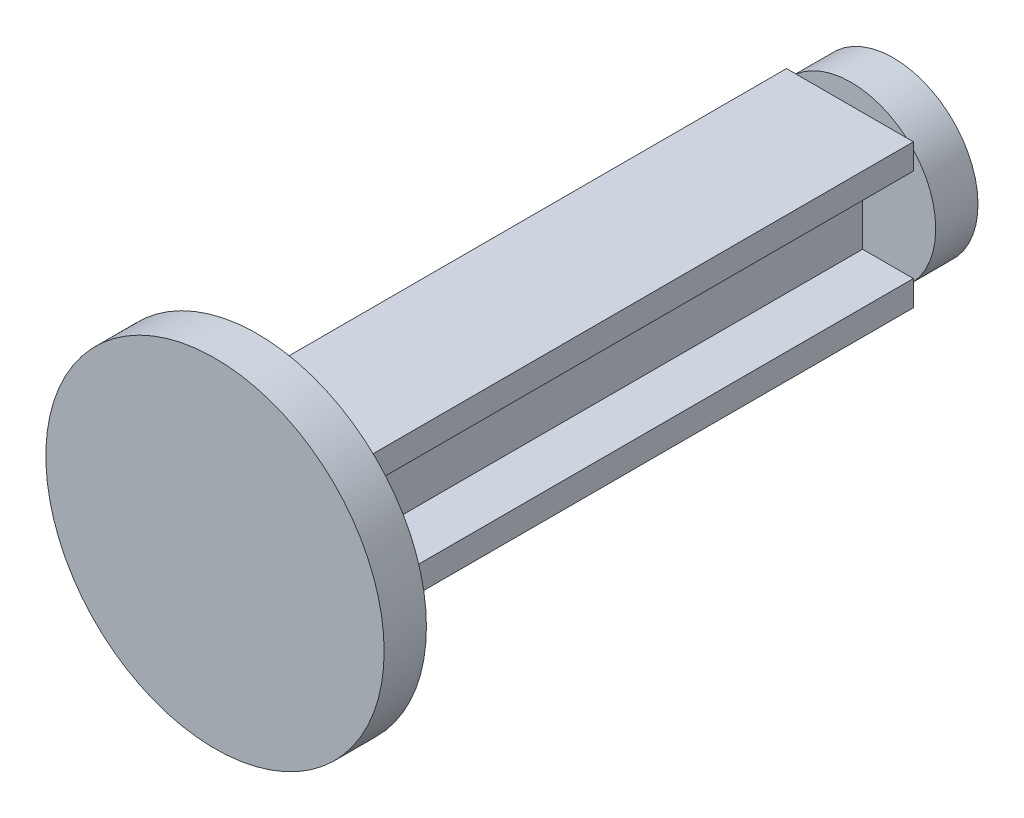
ISO-10303-21;
HEADER;
FILE_DESCRIPTION(('STEP AP214'),'2;1');
FILE_NAME('part.step','',(''),(''),'','','');
FILE_SCHEMA(('AUTOMOTIVE_DESIGN { 1 0 10303 214 1 1 1 1 }'));
ENDSEC;
DATA;
#1=APPLICATION_CONTEXT('core data for automotive mechanical design processes');
#2=APPLICATION_PROTOCOL_DEFINITION('international standard','automotive_design',2000,#1);
#3=PRODUCT_CONTEXT('',#1,'mechanical');
#4=PRODUCT('Part','Part','',(#3));
#5=PRODUCT_RELATED_PRODUCT_CATEGORY('part','',(#4));
#6=PRODUCT_DEFINITION_FORMATION('','',#4);
#7=PRODUCT_DEFINITION_CONTEXT('part definition',#1,'design');
#8=PRODUCT_DEFINITION('design','',#6,#7);
#9=PRODUCT_DEFINITION_SHAPE('','',#8);
#10=(LENGTH_UNIT() NAMED_UNIT(*) SI_UNIT(.MILLI.,.METRE.));
#11=(NAMED_UNIT(*) PLANE_ANGLE_UNIT() SI_UNIT($,.RADIAN.));
#12=(NAMED_UNIT(*) SI_UNIT($,.STERADIAN.) SOLID_ANGLE_UNIT());
#13=UNCERTAINTY_MEASURE_WITH_UNIT(LENGTH_MEASURE(1.E-05),#10,'distance_accuracy_value','');
#14=(GEOMETRIC_REPRESENTATION_CONTEXT(3) GLOBAL_UNCERTAINTY_ASSIGNED_CONTEXT((#13)) GLOBAL_UNIT_ASSIGNED_CONTEXT((#10,
#11,#12)) REPRESENTATION_CONTEXT('',''));
#15=CARTESIAN_POINT('',(0.,0.,0.));
#16=DIRECTION('',(0.,0.,1.));
#17=DIRECTION('',(1.,0.,0.));
#18=AXIS2_PLACEMENT_3D('',#15,#16,#17);
#19=CARTESIAN_POINT('',(0.,0.,0.));
#20=DIRECTION('',(0.,0.,1.));
#21=DIRECTION('',(1.,0.,0.));
#22=AXIS2_PLACEMENT_3D('',#19,#20,#21);
#23=PLANE('',#22);
#24=CARTESIAN_POINT('',(-8.59379801984639,0.,0.));
#25=DIRECTION('',(0.,0.,-1.));
#26=DIRECTION('',(-1.,0.,0.));
#27=AXIS2_PLACEMENT_3D('',#24,#25,#26);
#28=CIRCLE('',#27,20.);
#29=CARTESIAN_POINT('',(-23.8794937504474,12.8975775257018,0.));
#30=VERTEX_POINT('',#29);
#31=CARTESIAN_POINT('',(-21.63355885004,15.1645849759019,0.));
#32=VERTEX_POINT('',#31);
#33=EDGE_CURVE('E212',#30,#32,#28,.T.);
#34=ORIENTED_EDGE('',*,*,#33,.F.);
#35=DIRECTION('',(0.,-1.,0.));
#36=VECTOR('',#35,1.);
#37=CARTESIAN_POINT('',(-23.8794937504474,0.,0.));
#38=LINE('',#37,#36);
#39=CARTESIAN_POINT('',(-23.8794937504474,15.1645849759019,0.));
#40=VERTEX_POINT('',#39);
#41=EDGE_CURVE('E251',#40,#30,#38,.T.);
#42=ORIENTED_EDGE('',*,*,#41,.F.);
#43=DIRECTION('',(1.,0.,0.));
#44=VECTOR('',#43,1.);
#45=CARTESIAN_POINT('',(0.,15.1645849759019,0.));
#46=LINE('',#45,#44);
#47=EDGE_CURVE('E248',#40,#32,#46,.T.);
#48=ORIENTED_EDGE('',*,*,#47,.T.);
#49=EDGE_LOOP('',(#34,#42,#48));
#50=FACE_BOUND('',#49,.T.);
#51=ADVANCED_FACE('F60',(#50),#23,.F.);
#52=CARTESIAN_POINT('',(4.44596281034719,15.1645849759019,0.));
#53=VERTEX_POINT('',#52);
#54=CARTESIAN_POINT('',(6.12050624955264,13.5458203837031,0.));
#55=VERTEX_POINT('',#54);
#56=EDGE_CURVE('E14',#53,#55,#28,.T.);
#57=ORIENTED_EDGE('',*,*,#56,.F.);
#58=CARTESIAN_POINT('',(6.12050624955264,15.1645849759019,0.));
#59=VERTEX_POINT('',#58);
#60=EDGE_CURVE('E250',#53,#59,#46,.T.);
#61=ORIENTED_EDGE('',*,*,#60,.T.);
#62=DIRECTION('',(0.,-1.,0.));
#63=VECTOR('',#62,1.);
#64=CARTESIAN_POINT('',(6.12050624955264,0.,0.));
#65=LINE('',#64,#63);
#66=EDGE_CURVE('E247',#59,#55,#65,.T.);
#67=ORIENTED_EDGE('',*,*,#66,.T.);
#68=EDGE_LOOP('',(#57,#61,#67));
#69=FACE_BOUND('',#68,.T.);
#70=ADVANCED_FACE('F368',(#69),#23,.F.);
#71=CARTESIAN_POINT('',(6.12050624955264,-13.5458203837031,0.));
#72=VERTEX_POINT('',#71);
#73=CARTESIAN_POINT('',(-1.86868531670314,-18.8354150240981,0.));
#74=VERTEX_POINT('',#73);
#75=EDGE_CURVE('E68',#72,#74,#28,.T.);
#76=ORIENTED_EDGE('',*,*,#75,.F.);
#77=DIRECTION('',(0.,-1.,0.));
#78=VECTOR('',#77,1.);
#79=CARTESIAN_POINT('',(6.12050624955264,0.,0.));
#80=LINE('',#79,#78);
#81=CARTESIAN_POINT('',(6.12050624955264,-18.8354150240981,0.));
#82=VERTEX_POINT('',#81);
#83=EDGE_CURVE('E275',#72,#82,#80,.T.);
#84=ORIENTED_EDGE('',*,*,#83,.T.);
#85=DIRECTION('',(1.,0.,0.));
#86=VECTOR('',#85,1.);
#87=CARTESIAN_POINT('',(0.,-18.8354150240981,0.));
#88=LINE('',#87,#86);
#89=EDGE_CURVE('E268',#74,#82,#88,.T.);
#90=ORIENTED_EDGE('',*,*,#89,.F.);
#91=EDGE_LOOP('',(#76,#84,#90));
#92=FACE_BOUND('',#91,.T.);
#93=ADVANCED_FACE('F308',(#92),#23,.F.);
#94=CARTESIAN_POINT('',(6.12050624955264,0.,140.));
#95=DIRECTION('',(1.,0.,0.));
#96=DIRECTION('',(0.,1.,0.));
#97=AXIS2_PLACEMENT_3D('',#94,#95,#96);
#98=PLANE('',#97);
#99=ORIENTED_EDGE('',*,*,#66,.F.);
#100=DIRECTION('',(0.,0.,-1.));
#101=VECTOR('',#100,1.);
#102=CARTESIAN_POINT('',(6.12050624955264,15.1645849759019,140.));
#103=LINE('',#102,#101);
#104=CARTESIAN_POINT('',(6.12050624955264,15.1645849759019,140.));
#105=VERTEX_POINT('',#104);
#106=EDGE_CURVE('E62',#105,#59,#103,.T.);
#107=ORIENTED_EDGE('',*,*,#106,.F.);
#108=DIRECTION('',(0.,-1.,0.));
#109=VECTOR('',#108,1.);
#110=CARTESIAN_POINT('',(6.12050624955264,0.,140.));
#111=LINE('',#110,#109);
#112=CARTESIAN_POINT('',(6.12050624955264,9.16458497590189,140.));
#113=VERTEX_POINT('',#112);
#114=EDGE_CURVE('E175',#105,#113,#111,.T.);
#115=ORIENTED_EDGE('',*,*,#114,.T.);
#116=DIRECTION('',(0.,0.,-1.));
#117=VECTOR('',#116,1.);
#118=CARTESIAN_POINT('',(6.12050624955264,9.16458497590189,140.));
#119=LINE('',#118,#117);
#120=CARTESIAN_POINT('',(6.12050624955264,9.16458497590189,0.));
#121=VERTEX_POINT('',#120);
#122=EDGE_CURVE('E173',#113,#121,#119,.T.);
#123=ORIENTED_EDGE('',*,*,#122,.T.);
#124=EDGE_CURVE('E225',#55,#121,#65,.T.);
#125=ORIENTED_EDGE('',*,*,#124,.F.);
#126=EDGE_LOOP('',(#99,#107,#115,#123,#125));
#127=FACE_BOUND('',#126,.T.);
#128=ADVANCED_FACE('F56',(#127),#98,.T.);
#129=CARTESIAN_POINT('',(0.,15.1645849759019,140.));
#130=DIRECTION('',(0.,1.,0.));
#131=DIRECTION('',(0.,0.,1.));
#132=AXIS2_PLACEMENT_3D('',#129,#130,#131);
#133=PLANE('',#132);
#134=ORIENTED_EDGE('',*,*,#47,.F.);
#135=DIRECTION('',(0.,0.,-1.));
#136=VECTOR('',#135,1.);
#137=CARTESIAN_POINT('',(-23.8794937504474,15.1645849759019,140.));
#138=LINE('',#137,#136);
#139=CARTESIAN_POINT('',(-23.8794937504474,15.1645849759019,140.));
#140=VERTEX_POINT('',#139);
#141=EDGE_CURVE('E298',#140,#40,#138,.T.);
#142=ORIENTED_EDGE('',*,*,#141,.F.);
#143=DIRECTION('',(1.,0.,0.));
#144=VECTOR('',#143,1.);
#145=CARTESIAN_POINT('',(0.,15.1645849759019,140.));
#146=LINE('',#145,#144);
#147=EDGE_CURVE('E185',#140,#105,#146,.T.);
#148=ORIENTED_EDGE('',*,*,#147,.T.);
#149=ORIENTED_EDGE('',*,*,#106,.T.);
#150=ORIENTED_EDGE('',*,*,#60,.F.);
#151=EDGE_CURVE('E78',#32,#53,#46,.T.);
#152=ORIENTED_EDGE('',*,*,#151,.F.);
#153=EDGE_LOOP('',(#134,#142,#148,#149,#150,#152));
#154=FACE_BOUND('',#153,.T.);
#155=ADVANCED_FACE('F382',(#154),#133,.T.);
#156=CARTESIAN_POINT('',(-23.8794937504474,0.,140.));
#157=DIRECTION('',(1.,0.,0.));
#158=DIRECTION('',(0.,0.,-1.));
#159=AXIS2_PLACEMENT_3D('',#156,#157,#158);
#160=PLANE('',#159);
#161=ORIENTED_EDGE('',*,*,#41,.T.);
#162=CARTESIAN_POINT('',(-23.8794937504474,9.16458497590189,0.));
#163=VERTEX_POINT('',#162);
#164=EDGE_CURVE('E249',#30,#163,#38,.T.);
#165=ORIENTED_EDGE('',*,*,#164,.T.);
#166=DIRECTION('',(0.,0.,-1.));
#167=VECTOR('',#166,1.);
#168=CARTESIAN_POINT('',(-23.8794937504474,9.16458497590189,140.));
#169=LINE('',#168,#167);
#170=CARTESIAN_POINT('',(-23.8794937504474,9.16458497590189,140.));
#171=VERTEX_POINT('',#170);
#172=EDGE_CURVE('E299',#171,#163,#169,.T.);
#173=ORIENTED_EDGE('',*,*,#172,.F.);
#174=DIRECTION('',(0.,-1.,0.));
#175=VECTOR('',#174,1.);
#176=CARTESIAN_POINT('',(-23.8794937504474,0.,140.));
#177=LINE('',#176,#175);
#178=EDGE_CURVE('E210',#140,#171,#177,.T.);
#179=ORIENTED_EDGE('',*,*,#178,.F.);
#180=ORIENTED_EDGE('',*,*,#141,.T.);
#181=EDGE_LOOP('',(#161,#165,#173,#179,#180));
#182=FACE_BOUND('',#181,.T.);
#183=ADVANCED_FACE('F389',(#182),#160,.F.);
#184=CARTESIAN_POINT('',(0.,9.16458497590189,140.));
#185=DIRECTION('',(0.,1.,0.));
#186=DIRECTION('',(0.,0.,1.));
#187=AXIS2_PLACEMENT_3D('',#184,#185,#186);
#188=PLANE('',#187);
#189=DIRECTION('',(1.,0.,0.));
#190=VECTOR('',#189,1.);
#191=CARTESIAN_POINT('',(0.,9.16458497590189,0.));
#192=LINE('',#191,#190);
#193=CARTESIAN_POINT('',(-11.8794937504474,9.16458497590189,0.));
#194=VERTEX_POINT('',#193);
#195=EDGE_CURVE('E258',#163,#194,#192,.T.);
#196=ORIENTED_EDGE('',*,*,#195,.T.);
#197=DIRECTION('',(0.,0.,-1.));
#198=VECTOR('',#197,1.);
#199=CARTESIAN_POINT('',(-11.8794937504474,9.16458497590189,140.));
#200=LINE('',#199,#198);
#201=CARTESIAN_POINT('',(-11.8794937504474,9.16458497590189,140.));
#202=VERTEX_POINT('',#201);
#203=EDGE_CURVE('E293',#202,#194,#200,.T.);
#204=ORIENTED_EDGE('',*,*,#203,.F.);
#205=DIRECTION('',(1.,0.,0.));
#206=VECTOR('',#205,1.);
#207=CARTESIAN_POINT('',(0.,9.16458497590189,140.));
#208=LINE('',#207,#206);
#209=EDGE_CURVE('E199',#171,#202,#208,.T.);
#210=ORIENTED_EDGE('',*,*,#209,.F.);
#211=ORIENTED_EDGE('',*,*,#172,.T.);
#212=EDGE_LOOP('',(#196,#204,#210,#211));
#213=FACE_BOUND('',#212,.T.);
#214=ADVANCED_FACE('F377',(#213),#188,.F.);
#215=CARTESIAN_POINT('',(-11.8794937504474,0.,140.));
#216=DIRECTION('',(1.,0.,0.));
#217=DIRECTION('',(0.,1.,0.));
#218=AXIS2_PLACEMENT_3D('',#215,#216,#217);
#219=PLANE('',#218);
#220=DIRECTION('',(0.,-1.,0.));
#221=VECTOR('',#220,1.);
#222=CARTESIAN_POINT('',(-11.8794937504474,0.,0.));
#223=LINE('',#222,#221);
#224=CARTESIAN_POINT('',(-11.8794937504474,-12.8354150240981,0.));
#225=VERTEX_POINT('',#224);
#226=EDGE_CURVE('E256',#194,#225,#223,.T.);
#227=ORIENTED_EDGE('',*,*,#226,.T.);
#228=DIRECTION('',(0.,0.,-1.));
#229=VECTOR('',#228,1.);
#230=CARTESIAN_POINT('',(-11.8794937504474,-12.8354150240981,140.));
#231=LINE('',#230,#229);
#232=CARTESIAN_POINT('',(-11.8794937504474,-12.8354150240981,140.));
#233=VERTEX_POINT('',#232);
#234=EDGE_CURVE('E291',#233,#225,#231,.T.);
#235=ORIENTED_EDGE('',*,*,#234,.F.);
#236=DIRECTION('',(0.,-1.,0.));
#237=VECTOR('',#236,1.);
#238=CARTESIAN_POINT('',(-11.8794937504474,0.,140.));
#239=LINE('',#238,#237);
#240=EDGE_CURVE('E206',#202,#233,#239,.T.);
#241=ORIENTED_EDGE('',*,*,#240,.F.);
#242=ORIENTED_EDGE('',*,*,#203,.T.);
#243=EDGE_LOOP('',(#227,#235,#241,#242));
#244=FACE_BOUND('',#243,.T.);
#245=ADVANCED_FACE('F338',(#244),#219,.F.);
#246=CARTESIAN_POINT('',(0.,-12.8354150240981,140.));
#247=DIRECTION('',(0.,1.,0.));
#248=DIRECTION('',(0.,0.,1.));
#249=AXIS2_PLACEMENT_3D('',#246,#247,#248);
#250=PLANE('',#249);
#251=DIRECTION('',(1.,0.,0.));
#252=VECTOR('',#251,1.);
#253=CARTESIAN_POINT('',(0.,-12.8354150240981,0.));
#254=LINE('',#253,#252);
#255=CARTESIAN_POINT('',(-23.8794937504474,-12.8354150240981,0.));
#256=VERTEX_POINT('',#255);
#257=EDGE_CURVE('E261',#256,#225,#254,.T.);
#258=ORIENTED_EDGE('',*,*,#257,.F.);
#259=DIRECTION('',(0.,0.,-1.));
#260=VECTOR('',#259,1.);
#261=CARTESIAN_POINT('',(-23.8794937504474,-12.8354150240981,140.));
#262=LINE('',#261,#260);
#263=CARTESIAN_POINT('',(-23.8794937504474,-12.8354150240981,140.));
#264=VERTEX_POINT('',#263);
#265=EDGE_CURVE('E292',#264,#256,#262,.T.);
#266=ORIENTED_EDGE('',*,*,#265,.F.);
#267=DIRECTION('',(1.,0.,0.));
#268=VECTOR('',#267,1.);
#269=CARTESIAN_POINT('',(0.,-12.8354150240981,140.));
#270=LINE('',#269,#268);
#271=EDGE_CURVE('E211',#264,#233,#270,.T.);
#272=ORIENTED_EDGE('',*,*,#271,.T.);
#273=ORIENTED_EDGE('',*,*,#234,.T.);
#274=EDGE_LOOP('',(#258,#266,#272,#273));
#275=FACE_BOUND('',#274,.T.);
#276=ADVANCED_FACE('F340',(#275),#250,.T.);
#277=CARTESIAN_POINT('',(-23.8794937504474,0.,140.));
#278=DIRECTION('',(1.,0.,0.));
#279=DIRECTION('',(0.,0.,-1.));
#280=AXIS2_PLACEMENT_3D('',#277,#278,#279);
#281=PLANE('',#280);
#282=DIRECTION('',(0.,-1.,0.));
#283=VECTOR('',#282,1.);
#284=CARTESIAN_POINT('',(-23.8794937504474,0.,0.));
#285=LINE('',#284,#283);
#286=CARTESIAN_POINT('',(-23.8794937504474,-12.8975775257018,0.));
#287=VERTEX_POINT('',#286);
#288=EDGE_CURVE('E266',#256,#287,#285,.T.);
#289=ORIENTED_EDGE('',*,*,#288,.T.);
#290=CARTESIAN_POINT('',(-23.8794937504474,-18.8354150240981,0.));
#291=VERTEX_POINT('',#290);
#292=EDGE_CURVE('E262',#287,#291,#285,.T.);
#293=ORIENTED_EDGE('',*,*,#292,.T.);
#294=DIRECTION('',(0.,0.,-1.));
#295=VECTOR('',#294,1.);
#296=CARTESIAN_POINT('',(-23.8794937504474,-18.8354150240981,140.));
#297=LINE('',#296,#295);
#298=CARTESIAN_POINT('',(-23.8794937504474,-18.8354150240981,140.));
#299=VERTEX_POINT('',#298);
#300=EDGE_CURVE('E286',#299,#291,#297,.T.);
#301=ORIENTED_EDGE('',*,*,#300,.F.);
#302=DIRECTION('',(0.,-1.,0.));
#303=VECTOR('',#302,1.);
#304=CARTESIAN_POINT('',(-23.8794937504474,0.,140.));
#305=LINE('',#304,#303);
#306=EDGE_CURVE('E328',#264,#299,#305,.T.);
#307=ORIENTED_EDGE('',*,*,#306,.F.);
#308=ORIENTED_EDGE('',*,*,#265,.T.);
#309=EDGE_LOOP('',(#289,#293,#301,#307,#308));
#310=FACE_BOUND('',#309,.T.);
#311=ADVANCED_FACE('F349',(#310),#281,.F.);
#312=CARTESIAN_POINT('',(0.,-18.8354150240981,140.));
#313=DIRECTION('',(0.,1.,0.));
#314=DIRECTION('',(0.,0.,1.));
#315=AXIS2_PLACEMENT_3D('',#312,#313,#314);
#316=PLANE('',#315);
#317=CARTESIAN_POINT('',(-15.3189107229897,-18.8354150240981,0.));
#318=VERTEX_POINT('',#317);
#319=EDGE_CURVE('E267',#291,#318,#88,.T.);
#320=ORIENTED_EDGE('',*,*,#319,.T.);
#321=EDGE_CURVE('E272',#318,#74,#88,.T.);
#322=ORIENTED_EDGE('',*,*,#321,.T.);
#323=ORIENTED_EDGE('',*,*,#89,.T.);
#324=DIRECTION('',(0.,0.,-1.));
#325=VECTOR('',#324,1.);
#326=CARTESIAN_POINT('',(6.12050624955264,-18.8354150240981,140.));
#327=LINE('',#326,#325);
#328=CARTESIAN_POINT('',(6.12050624955264,-18.8354150240981,140.));
#329=VERTEX_POINT('',#328);
#330=EDGE_CURVE('E283',#329,#82,#327,.T.);
#331=ORIENTED_EDGE('',*,*,#330,.F.);
#332=DIRECTION('',(1.,0.,0.));
#333=VECTOR('',#332,1.);
#334=CARTESIAN_POINT('',(0.,-18.8354150240981,140.));
#335=LINE('',#334,#333);
#336=EDGE_CURVE('E323',#299,#329,#335,.T.);
#337=ORIENTED_EDGE('',*,*,#336,.F.);
#338=ORIENTED_EDGE('',*,*,#300,.T.);
#339=EDGE_LOOP('',(#320,#322,#323,#331,#337,#338));
#340=FACE_BOUND('',#339,.T.);
#341=ADVANCED_FACE('F351',(#340),#316,.F.);
#342=CARTESIAN_POINT('',(6.12050624955264,0.,140.));
#343=DIRECTION('',(1.,0.,0.));
#344=DIRECTION('',(0.,0.,-1.));
#345=AXIS2_PLACEMENT_3D('',#342,#343,#344);
#346=PLANE('',#345);
#347=CARTESIAN_POINT('',(6.12050624955264,-12.8354150240981,0.));
#348=VERTEX_POINT('',#347);
#349=EDGE_CURVE('E273',#348,#72,#80,.T.);
#350=ORIENTED_EDGE('',*,*,#349,.F.);
#351=DIRECTION('',(0.,0.,-1.));
#352=VECTOR('',#351,1.);
#353=CARTESIAN_POINT('',(6.12050624955264,-12.8354150240981,140.));
#354=LINE('',#353,#352);
#355=CARTESIAN_POINT('',(6.12050624955264,-12.8354150240981,140.));
#356=VERTEX_POINT('',#355);
#357=EDGE_CURVE('E284',#356,#348,#354,.T.);
#358=ORIENTED_EDGE('',*,*,#357,.F.);
#359=DIRECTION('',(0.,-1.,0.));
#360=VECTOR('',#359,1.);
#361=CARTESIAN_POINT('',(6.12050624955264,0.,140.));
#362=LINE('',#361,#360);
#363=EDGE_CURVE('E321',#356,#329,#362,.T.);
#364=ORIENTED_EDGE('',*,*,#363,.T.);
#365=ORIENTED_EDGE('',*,*,#330,.T.);
#366=ORIENTED_EDGE('',*,*,#83,.F.);
#367=EDGE_LOOP('',(#350,#358,#364,#365,#366));
#368=FACE_BOUND('',#367,.T.);
#369=ADVANCED_FACE('F309',(#368),#346,.T.);
#370=CARTESIAN_POINT('',(-5.87949375044736,-12.8354150240981,0.));
#371=VERTEX_POINT('',#370);
#372=EDGE_CURVE('E264',#371,#348,#254,.T.);
#373=ORIENTED_EDGE('',*,*,#372,.F.);
#374=DIRECTION('',(0.,0.,-1.));
#375=VECTOR('',#374,1.);
#376=CARTESIAN_POINT('',(-5.87949375044736,-12.8354150240981,140.));
#377=LINE('',#376,#375);
#378=CARTESIAN_POINT('',(-5.87949375044736,-12.8354150240981,140.));
#379=VERTEX_POINT('',#378);
#380=EDGE_CURVE('E282',#379,#371,#377,.T.);
#381=ORIENTED_EDGE('',*,*,#380,.F.);
#382=EDGE_CURVE('E203',#379,#356,#270,.T.);
#383=ORIENTED_EDGE('',*,*,#382,.T.);
#384=ORIENTED_EDGE('',*,*,#357,.T.);
#385=EDGE_LOOP('',(#373,#381,#383,#384));
#386=FACE_BOUND('',#385,.T.);
#387=ADVANCED_FACE('F318',(#386),#250,.T.);
#388=CARTESIAN_POINT('',(-5.87949375044736,0.,140.));
#389=DIRECTION('',(1.,0.,0.));
#390=DIRECTION('',(0.,1.,0.));
#391=AXIS2_PLACEMENT_3D('',#388,#389,#390);
#392=PLANE('',#391);
#393=DIRECTION('',(0.,-1.,0.));
#394=VECTOR('',#393,1.);
#395=CARTESIAN_POINT('',(-5.87949375044736,0.,0.));
#396=LINE('',#395,#394);
#397=CARTESIAN_POINT('',(-5.87949375044736,9.16458497590189,0.));
#398=VERTEX_POINT('',#397);
#399=EDGE_CURVE('E280',#398,#371,#396,.T.);
#400=ORIENTED_EDGE('',*,*,#399,.F.);
#401=DIRECTION('',(0.,0.,-1.));
#402=VECTOR('',#401,1.);
#403=CARTESIAN_POINT('',(-5.87949375044736,9.16458497590189,140.));
#404=LINE('',#403,#402);
#405=CARTESIAN_POINT('',(-5.87949375044736,9.16458497590189,140.));
#406=VERTEX_POINT('',#405);
#407=EDGE_CURVE('E195',#406,#398,#404,.T.);
#408=ORIENTED_EDGE('',*,*,#407,.F.);
#409=DIRECTION('',(0.,-1.,0.));
#410=VECTOR('',#409,1.);
#411=CARTESIAN_POINT('',(-5.87949375044736,0.,140.));
#412=LINE('',#411,#410);
#413=EDGE_CURVE('E196',#406,#379,#412,.T.);
#414=ORIENTED_EDGE('',*,*,#413,.T.);
#415=ORIENTED_EDGE('',*,*,#380,.T.);
#416=EDGE_LOOP('',(#400,#408,#414,#415));
#417=FACE_BOUND('',#416,.T.);
#418=ADVANCED_FACE('F378',(#417),#392,.T.);
#419=EDGE_CURVE('E181',#398,#121,#192,.T.);
#420=ORIENTED_EDGE('',*,*,#419,.T.);
#421=ORIENTED_EDGE('',*,*,#122,.F.);
#422=EDGE_CURVE('E189',#406,#113,#208,.T.);
#423=ORIENTED_EDGE('',*,*,#422,.F.);
#424=ORIENTED_EDGE('',*,*,#407,.T.);
#425=EDGE_LOOP('',(#420,#421,#423,#424));
#426=FACE_BOUND('',#425,.T.);
#427=ADVANCED_FACE('F190',(#426),#188,.F.);
#428=EDGE_CURVE('E218',#318,#287,#28,.T.);
#429=ORIENTED_EDGE('',*,*,#428,.F.);
#430=ORIENTED_EDGE('',*,*,#319,.F.);
#431=ORIENTED_EDGE('',*,*,#292,.F.);
#432=EDGE_LOOP('',(#429,#430,#431));
#433=FACE_BOUND('',#432,.T.);
#434=ADVANCED_FACE('F355',(#433),#23,.F.);
#435=CARTESIAN_POINT('',(-8.59379801984639,0.,0.));
#436=DIRECTION('',(0.,0.,-1.));
#437=DIRECTION('',(-1.,0.,0.));
#438=AXIS2_PLACEMENT_3D('',#435,#436,#437);
#439=PLANE('',#438);
#440=EDGE_CURVE('E237',#55,#72,#28,.T.);
#441=ORIENTED_EDGE('',*,*,#440,.F.);
#442=ORIENTED_EDGE('',*,*,#124,.T.);
#443=ORIENTED_EDGE('',*,*,#419,.F.);
#444=ORIENTED_EDGE('',*,*,#399,.T.);
#445=ORIENTED_EDGE('',*,*,#372,.T.);
#446=ORIENTED_EDGE('',*,*,#349,.T.);
#447=EDGE_LOOP('',(#441,#442,#443,#444,#445,#446));
#448=FACE_BOUND('',#447,.T.);
#449=ADVANCED_FACE('F314',(#448),#439,.F.);
#450=ORIENTED_EDGE('',*,*,#321,.F.);
#451=EDGE_CURVE('E233',#74,#318,#28,.T.);
#452=ORIENTED_EDGE('',*,*,#451,.F.);
#453=EDGE_LOOP('',(#450,#452));
#454=FACE_BOUND('',#453,.T.);
#455=ADVANCED_FACE('F358',(#454),#439,.F.);
#456=EDGE_CURVE('E66',#32,#53,#28,.T.);
#457=ORIENTED_EDGE('',*,*,#456,.F.);
#458=ORIENTED_EDGE('',*,*,#151,.T.);
#459=EDGE_LOOP('',(#457,#458));
#460=FACE_BOUND('',#459,.T.);
#461=ADVANCED_FACE('F243',(#460),#439,.F.);
#462=CARTESIAN_POINT('',(-8.59379801984639,0.,-10.));
#463=DIRECTION('',(0.,0.,1.));
#464=DIRECTION('',(1.,0.,0.));
#465=AXIS2_PLACEMENT_3D('',#462,#463,#464);
#466=CYLINDRICAL_SURFACE('',#465,20.);
#467=CARTESIAN_POINT('',(-8.59379801984639,0.,-10.));
#468=DIRECTION('',(0.,0.,-1.));
#469=DIRECTION('',(-1.,0.,0.));
#470=AXIS2_PLACEMENT_3D('',#467,#468,#469);
#471=CIRCLE('',#470,20.);
#472=CARTESIAN_POINT('',(-28.5937980198464,0.,-10.));
#473=VERTEX_POINT('',#472);
#474=EDGE_CURVE('E220',#473,#473,#471,.T.);
#475=ORIENTED_EDGE('',*,*,#474,.F.);
#476=EDGE_LOOP('',(#475));
#477=FACE_BOUND('',#476,.T.);
#478=ORIENTED_EDGE('',*,*,#33,.T.);
#479=ORIENTED_EDGE('',*,*,#456,.T.);
#480=ORIENTED_EDGE('',*,*,#56,.T.);
#481=ORIENTED_EDGE('',*,*,#440,.T.);
#482=ORIENTED_EDGE('',*,*,#75,.T.);
#483=ORIENTED_EDGE('',*,*,#451,.T.);
#484=ORIENTED_EDGE('',*,*,#428,.T.);
#485=EDGE_CURVE('E217',#287,#30,#28,.T.);
#486=ORIENTED_EDGE('',*,*,#485,.T.);
#487=EDGE_LOOP('',(#478,#479,#480,#481,#482,#483,#484,#486));
#488=FACE_BOUND('',#487,.T.);
#489=ADVANCED_FACE('F244',(#477,#488),#466,.T.);
#490=CARTESIAN_POINT('',(-8.59379801984639,0.,-10.));
#491=DIRECTION('',(0.,0.,-1.));
#492=DIRECTION('',(-1.,0.,0.));
#493=AXIS2_PLACEMENT_3D('',#490,#491,#492);
#494=PLANE('',#493);
#495=ORIENTED_EDGE('',*,*,#474,.T.);
#496=EDGE_LOOP('',(#495));
#497=FACE_BOUND('',#496,.T.);
#498=ADVANCED_FACE('F448',(#497),#494,.T.);
#499=ORIENTED_EDGE('',*,*,#288,.F.);
#500=ORIENTED_EDGE('',*,*,#257,.T.);
#501=ORIENTED_EDGE('',*,*,#226,.F.);
#502=ORIENTED_EDGE('',*,*,#195,.F.);
#503=ORIENTED_EDGE('',*,*,#164,.F.);
#504=ORIENTED_EDGE('',*,*,#485,.F.);
#505=EDGE_LOOP('',(#499,#500,#501,#502,#503,#504));
#506=FACE_BOUND('',#505,.T.);
#507=ADVANCED_FACE('F342',(#506),#439,.F.);
#508=CARTESIAN_POINT('',(-9.03201898634227,-1.71847387704822,150.));
#509=DIRECTION('',(0.,0.,-1.));
#510=DIRECTION('',(-1.,0.,0.));
#511=AXIS2_PLACEMENT_3D('',#508,#509,#510);
#512=CYLINDRICAL_SURFACE('',#511,40.);
#513=CARTESIAN_POINT('',(-9.03201898634227,-1.71847387704822,150.));
#514=DIRECTION('',(0.,0.,1.));
#515=DIRECTION('',(1.,0.,0.));
#516=AXIS2_PLACEMENT_3D('',#513,#514,#515);
#517=CIRCLE('',#516,40.);
#518=CARTESIAN_POINT('',(30.9679810136577,-1.71847387704822,150.));
#519=VERTEX_POINT('',#518);
#520=EDGE_CURVE('E227',#519,#519,#517,.T.);
#521=ORIENTED_EDGE('',*,*,#520,.F.);
#522=EDGE_LOOP('',(#521));
#523=FACE_BOUND('',#522,.T.);
#524=CARTESIAN_POINT('',(-9.03201898634227,-1.71847387704822,140.));
#525=DIRECTION('',(0.,0.,1.));
#526=DIRECTION('',(1.,0.,0.));
#527=AXIS2_PLACEMENT_3D('',#524,#525,#526);
#528=CIRCLE('',#527,40.);
#529=CARTESIAN_POINT('',(30.9679810136577,-1.71847387704822,140.));
#530=VERTEX_POINT('',#529);
#531=EDGE_CURVE('E224',#530,#530,#528,.T.);
#532=ORIENTED_EDGE('',*,*,#531,.T.);
#533=EDGE_LOOP('',(#532));
#534=FACE_BOUND('',#533,.T.);
#535=ADVANCED_FACE('F419',(#523,#534),#512,.T.);
#536=CARTESIAN_POINT('',(-9.03201898634227,-1.71847387704822,150.));
#537=DIRECTION('',(0.,0.,1.));
#538=DIRECTION('',(1.,0.,0.));
#539=AXIS2_PLACEMENT_3D('',#536,#537,#538);
#540=PLANE('',#539);
#541=ORIENTED_EDGE('',*,*,#520,.T.);
#542=EDGE_LOOP('',(#541));
#543=FACE_BOUND('',#542,.T.);
#544=ADVANCED_FACE('F424',(#543),#540,.T.);
#545=CARTESIAN_POINT('',(-9.03201898634227,-1.71847387704822,140.));
#546=DIRECTION('',(0.,0.,1.));
#547=DIRECTION('',(1.,0.,0.));
#548=AXIS2_PLACEMENT_3D('',#545,#546,#547);
#549=PLANE('',#548);
#550=ORIENTED_EDGE('',*,*,#114,.F.);
#551=ORIENTED_EDGE('',*,*,#147,.F.);
#552=ORIENTED_EDGE('',*,*,#178,.T.);
#553=ORIENTED_EDGE('',*,*,#209,.T.);
#554=ORIENTED_EDGE('',*,*,#240,.T.);
#555=ORIENTED_EDGE('',*,*,#271,.F.);
#556=ORIENTED_EDGE('',*,*,#306,.T.);
#557=ORIENTED_EDGE('',*,*,#336,.T.);
#558=ORIENTED_EDGE('',*,*,#363,.F.);
#559=ORIENTED_EDGE('',*,*,#382,.F.);
#560=ORIENTED_EDGE('',*,*,#413,.F.);
#561=ORIENTED_EDGE('',*,*,#422,.T.);
#562=EDGE_LOOP('',(#550,#551,#552,#553,#554,#555,#556,#557,#558,#559,#560,#561));
#563=FACE_BOUND('',#562,.T.);
#564=ORIENTED_EDGE('',*,*,#531,.F.);
#565=EDGE_LOOP('',(#564));
#566=FACE_BOUND('',#565,.T.);
#567=ADVANCED_FACE('F194',(#563,#566),#549,.F.);
#568=CLOSED_SHELL('',(#51,#70,#93,#128,#155,#183,#214,#245,#276,#311,#341,#369,#387,#418,#427,
#434,#449,#455,#461,#489,#498,#507,#535,#544,#567));
#569=MANIFOLD_SOLID_BREP('B2',#568);
#570=ADVANCED_BREP_SHAPE_REPRESENTATION('',(#18,#569),#14);
#571=SHAPE_DEFINITION_REPRESENTATION(#9,#570);
ENDSEC;
END-ISO-10303-21;
